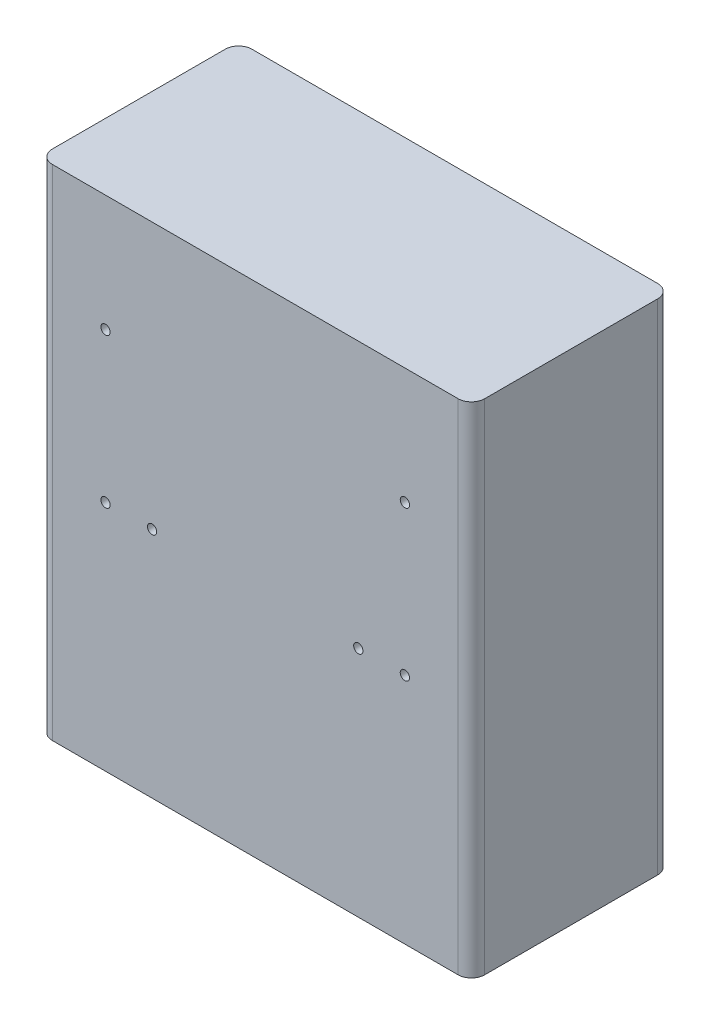
ISO-10303-21;
HEADER;
FILE_DESCRIPTION(('STEP AP214'),'2;1');
FILE_NAME('part.step','',(''),(''),'','','');
FILE_SCHEMA(('AUTOMOTIVE_DESIGN { 1 0 10303 214 1 1 1 1 }'));
ENDSEC;
DATA;
#1=APPLICATION_CONTEXT('core data for automotive mechanical design processes');
#2=APPLICATION_PROTOCOL_DEFINITION('international standard','automotive_design',2000,#1);
#3=PRODUCT_CONTEXT('',#1,'mechanical');
#4=PRODUCT('Part','Part','',(#3));
#5=PRODUCT_RELATED_PRODUCT_CATEGORY('part','',(#4));
#6=PRODUCT_DEFINITION_FORMATION('','',#4);
#7=PRODUCT_DEFINITION_CONTEXT('part definition',#1,'design');
#8=PRODUCT_DEFINITION('design','',#6,#7);
#9=PRODUCT_DEFINITION_SHAPE('','',#8);
#10=(LENGTH_UNIT() NAMED_UNIT(*) SI_UNIT(.MILLI.,.METRE.));
#11=(NAMED_UNIT(*) PLANE_ANGLE_UNIT() SI_UNIT($,.RADIAN.));
#12=(NAMED_UNIT(*) SI_UNIT($,.STERADIAN.) SOLID_ANGLE_UNIT());
#13=UNCERTAINTY_MEASURE_WITH_UNIT(LENGTH_MEASURE(1.E-05),#10,'distance_accuracy_value','');
#14=(GEOMETRIC_REPRESENTATION_CONTEXT(3) GLOBAL_UNCERTAINTY_ASSIGNED_CONTEXT((#13)) GLOBAL_UNIT_ASSIGNED_CONTEXT((#10,
#11,#12)) REPRESENTATION_CONTEXT('',''));
#15=CARTESIAN_POINT('',(0.,0.,0.));
#16=DIRECTION('',(0.,0.,1.));
#17=DIRECTION('',(1.,0.,0.));
#18=AXIS2_PLACEMENT_3D('',#15,#16,#17);
#19=CARTESIAN_POINT('',(41.275,-47.625,19.05));
#20=DIRECTION('',(-1.,0.,0.));
#21=DIRECTION('',(0.,0.,1.));
#22=AXIS2_PLACEMENT_3D('',#19,#20,#21);
#23=PLANE('',#22);
#24=DIRECTION('',(0.,0.,-1.));
#25=VECTOR('',#24,1.);
#26=CARTESIAN_POINT('',(41.275,-47.625,19.05));
#27=LINE('',#26,#25);
#28=CARTESIAN_POINT('',(41.275,-47.625,16.51));
#29=VERTEX_POINT('',#28);
#30=CARTESIAN_POINT('',(41.275,-47.625,-16.51));
#31=VERTEX_POINT('',#30);
#32=EDGE_CURVE('E121',#29,#31,#27,.T.);
#33=ORIENTED_EDGE('',*,*,#32,.T.);
#34=DIRECTION('',(0.,1.,0.));
#35=VECTOR('',#34,1.);
#36=CARTESIAN_POINT('',(41.275,47.625,-16.51));
#37=LINE('',#36,#35);
#38=CARTESIAN_POINT('',(41.275,47.625,-16.51));
#39=VERTEX_POINT('',#38);
#40=EDGE_CURVE('E147',#31,#39,#37,.T.);
#41=ORIENTED_EDGE('',*,*,#40,.T.);
#42=DIRECTION('',(0.,0.,-1.));
#43=VECTOR('',#42,1.);
#44=CARTESIAN_POINT('',(41.275,47.625,19.05));
#45=LINE('',#44,#43);
#46=CARTESIAN_POINT('',(41.275,47.625,16.51));
#47=VERTEX_POINT('',#46);
#48=EDGE_CURVE('E125',#47,#39,#45,.T.);
#49=ORIENTED_EDGE('',*,*,#48,.F.);
#50=DIRECTION('',(0.,1.,0.));
#51=VECTOR('',#50,1.);
#52=CARTESIAN_POINT('',(41.275,-47.625,16.51));
#53=LINE('',#52,#51);
#54=EDGE_CURVE('E145',#47,#29,#53,.F.);
#55=ORIENTED_EDGE('',*,*,#54,.T.);
#56=EDGE_LOOP('',(#33,#41,#49,#55));
#57=FACE_BOUND('',#56,.T.);
#58=ADVANCED_FACE('F33',(#57),#23,.F.);
#59=CARTESIAN_POINT('',(-41.275,47.625,19.05));
#60=DIRECTION('',(0.,-1.,0.));
#61=DIRECTION('',(0.,0.,-1.));
#62=AXIS2_PLACEMENT_3D('',#59,#60,#61);
#63=PLANE('',#62);
#64=DIRECTION('',(-1.,0.,0.));
#65=VECTOR('',#64,1.);
#66=CARTESIAN_POINT('',(-41.275,47.625,-19.05));
#67=LINE('',#66,#65);
#68=CARTESIAN_POINT('',(38.735,47.625,-19.05));
#69=VERTEX_POINT('',#68);
#70=CARTESIAN_POINT('',(-38.735,47.625,-19.05));
#71=VERTEX_POINT('',#70);
#72=EDGE_CURVE('E157',#69,#71,#67,.T.);
#73=ORIENTED_EDGE('',*,*,#72,.T.);
#74=CARTESIAN_POINT('',(-38.735,47.625,-16.51));
#75=DIRECTION('',(0.,-1.,0.));
#76=DIRECTION('',(0.,0.,-1.));
#77=AXIS2_PLACEMENT_3D('',#74,#75,#76);
#78=CIRCLE('',#77,2.54);
#79=CARTESIAN_POINT('',(-41.275,47.625,-16.51));
#80=VERTEX_POINT('',#79);
#81=EDGE_CURVE('E143',#71,#80,#78,.F.);
#82=ORIENTED_EDGE('',*,*,#81,.T.);
#83=DIRECTION('',(0.,0.,-1.));
#84=VECTOR('',#83,1.);
#85=CARTESIAN_POINT('',(-41.275,47.625,19.05));
#86=LINE('',#85,#84);
#87=CARTESIAN_POINT('',(-41.275,47.625,16.51));
#88=VERTEX_POINT('',#87);
#89=EDGE_CURVE('E120',#88,#80,#86,.T.);
#90=ORIENTED_EDGE('',*,*,#89,.F.);
#91=CARTESIAN_POINT('',(-38.735,47.625,16.51));
#92=DIRECTION('',(0.,-1.,0.));
#93=DIRECTION('',(0.,0.,-1.));
#94=AXIS2_PLACEMENT_3D('',#91,#92,#93);
#95=CIRCLE('',#94,2.54);
#96=CARTESIAN_POINT('',(-38.735,47.625,19.05));
#97=VERTEX_POINT('',#96);
#98=EDGE_CURVE('E124',#88,#97,#95,.F.);
#99=ORIENTED_EDGE('',*,*,#98,.T.);
#100=DIRECTION('',(-1.,0.,0.));
#101=VECTOR('',#100,1.);
#102=CARTESIAN_POINT('',(-41.275,47.625,19.05));
#103=LINE('',#102,#101);
#104=CARTESIAN_POINT('',(38.735,47.625,19.05));
#105=VERTEX_POINT('',#104);
#106=EDGE_CURVE('E152',#105,#97,#103,.T.);
#107=ORIENTED_EDGE('',*,*,#106,.F.);
#108=CARTESIAN_POINT('',(38.735,47.625,16.51));
#109=DIRECTION('',(0.,-1.,0.));
#110=DIRECTION('',(0.,0.,-1.));
#111=AXIS2_PLACEMENT_3D('',#108,#109,#110);
#112=CIRCLE('',#111,2.54);
#113=EDGE_CURVE('E56',#105,#47,#112,.F.);
#114=ORIENTED_EDGE('',*,*,#113,.T.);
#115=ORIENTED_EDGE('',*,*,#48,.T.);
#116=CARTESIAN_POINT('',(38.735,47.625,-16.51));
#117=DIRECTION('',(0.,-1.,0.));
#118=DIRECTION('',(0.,0.,-1.));
#119=AXIS2_PLACEMENT_3D('',#116,#117,#118);
#120=CIRCLE('',#119,2.54);
#121=EDGE_CURVE('E48',#39,#69,#120,.F.);
#122=ORIENTED_EDGE('',*,*,#121,.T.);
#123=EDGE_LOOP('',(#73,#82,#90,#99,#107,#114,#115,#122));
#124=FACE_BOUND('',#123,.T.);
#125=ADVANCED_FACE('F190',(#124),#63,.F.);
#126=CARTESIAN_POINT('',(-41.275,-47.625,19.05));
#127=DIRECTION('',(1.,0.,0.));
#128=DIRECTION('',(0.,0.,-1.));
#129=AXIS2_PLACEMENT_3D('',#126,#127,#128);
#130=PLANE('',#129);
#131=ORIENTED_EDGE('',*,*,#89,.T.);
#132=DIRECTION('',(0.,-1.,0.));
#133=VECTOR('',#132,1.);
#134=CARTESIAN_POINT('',(-41.275,-47.625,-16.51));
#135=LINE('',#134,#133);
#136=CARTESIAN_POINT('',(-41.275,-47.625,-16.51));
#137=VERTEX_POINT('',#136);
#138=EDGE_CURVE('E111',#80,#137,#135,.T.);
#139=ORIENTED_EDGE('',*,*,#138,.T.);
#140=DIRECTION('',(0.,0.,-1.));
#141=VECTOR('',#140,1.);
#142=CARTESIAN_POINT('',(-41.275,-47.625,19.05));
#143=LINE('',#142,#141);
#144=CARTESIAN_POINT('',(-41.275,-47.625,16.51));
#145=VERTEX_POINT('',#144);
#146=EDGE_CURVE('E103',#145,#137,#143,.T.);
#147=ORIENTED_EDGE('',*,*,#146,.F.);
#148=DIRECTION('',(0.,-1.,0.));
#149=VECTOR('',#148,1.);
#150=CARTESIAN_POINT('',(-41.275,-47.625,16.51));
#151=LINE('',#150,#149);
#152=EDGE_CURVE('E117',#145,#88,#151,.F.);
#153=ORIENTED_EDGE('',*,*,#152,.T.);
#154=EDGE_LOOP('',(#131,#139,#147,#153));
#155=FACE_BOUND('',#154,.T.);
#156=ADVANCED_FACE('F116',(#155),#130,.F.);
#157=CARTESIAN_POINT('',(-41.275,-47.625,19.05));
#158=DIRECTION('',(0.,1.,0.));
#159=DIRECTION('',(0.,0.,1.));
#160=AXIS2_PLACEMENT_3D('',#157,#158,#159);
#161=PLANE('',#160);
#162=ORIENTED_EDGE('',*,*,#146,.T.);
#163=CARTESIAN_POINT('',(-38.735,-47.625,-16.51));
#164=DIRECTION('',(0.,1.,0.));
#165=DIRECTION('',(0.,0.,1.));
#166=AXIS2_PLACEMENT_3D('',#163,#164,#165);
#167=CIRCLE('',#166,2.54);
#168=CARTESIAN_POINT('',(-38.735,-47.625,-19.05));
#169=VERTEX_POINT('',#168);
#170=EDGE_CURVE('E134',#137,#169,#167,.F.);
#171=ORIENTED_EDGE('',*,*,#170,.T.);
#172=DIRECTION('',(1.,0.,0.));
#173=VECTOR('',#172,1.);
#174=CARTESIAN_POINT('',(-41.275,-47.625,-19.05));
#175=LINE('',#174,#173);
#176=CARTESIAN_POINT('',(38.735,-47.625,-19.05));
#177=VERTEX_POINT('',#176);
#178=EDGE_CURVE('E153',#169,#177,#175,.T.);
#179=ORIENTED_EDGE('',*,*,#178,.T.);
#180=CARTESIAN_POINT('',(38.735,-47.625,-16.51));
#181=DIRECTION('',(0.,1.,0.));
#182=DIRECTION('',(0.,0.,1.));
#183=AXIS2_PLACEMENT_3D('',#180,#181,#182);
#184=CIRCLE('',#183,2.54);
#185=EDGE_CURVE('E132',#177,#31,#184,.F.);
#186=ORIENTED_EDGE('',*,*,#185,.T.);
#187=ORIENTED_EDGE('',*,*,#32,.F.);
#188=CARTESIAN_POINT('',(38.735,-47.625,16.51));
#189=DIRECTION('',(0.,1.,0.));
#190=DIRECTION('',(0.,0.,1.));
#191=AXIS2_PLACEMENT_3D('',#188,#189,#190);
#192=CIRCLE('',#191,2.54);
#193=CARTESIAN_POINT('',(38.735,-47.625,19.05));
#194=VERTEX_POINT('',#193);
#195=EDGE_CURVE('E110',#29,#194,#192,.F.);
#196=ORIENTED_EDGE('',*,*,#195,.T.);
#197=DIRECTION('',(1.,0.,0.));
#198=VECTOR('',#197,1.);
#199=CARTESIAN_POINT('',(-41.275,-47.625,19.05));
#200=LINE('',#199,#198);
#201=CARTESIAN_POINT('',(-38.735,-47.625,19.05));
#202=VERTEX_POINT('',#201);
#203=EDGE_CURVE('E105',#202,#194,#200,.T.);
#204=ORIENTED_EDGE('',*,*,#203,.F.);
#205=CARTESIAN_POINT('',(-38.735,-47.625,16.51));
#206=DIRECTION('',(0.,1.,0.));
#207=DIRECTION('',(0.,0.,1.));
#208=AXIS2_PLACEMENT_3D('',#205,#206,#207);
#209=CIRCLE('',#208,2.54);
#210=EDGE_CURVE('E100',#202,#145,#209,.F.);
#211=ORIENTED_EDGE('',*,*,#210,.T.);
#212=EDGE_LOOP('',(#162,#171,#179,#186,#187,#196,#204,#211));
#213=FACE_BOUND('',#212,.T.);
#214=ADVANCED_FACE('F102',(#213),#161,.F.);
#215=CARTESIAN_POINT('',(0.,0.,19.05));
#216=DIRECTION('',(0.,0.,-1.));
#217=DIRECTION('',(-1.,0.,0.));
#218=AXIS2_PLACEMENT_3D('',#215,#216,#217);
#219=PLANE('',#218);
#220=CARTESIAN_POINT('',(28.575,25.4,19.05));
#221=DIRECTION('',(0.,0.,1.));
#222=DIRECTION('',(1.,0.,0.));
#223=AXIS2_PLACEMENT_3D('',#220,#221,#222);
#224=CIRCLE('',#223,0.888999999999997);
#225=CARTESIAN_POINT('',(29.464,25.4,19.05));
#226=VERTEX_POINT('',#225);
#227=EDGE_CURVE('E365',#226,#226,#224,.T.);
#228=ORIENTED_EDGE('',*,*,#227,.F.);
#229=EDGE_LOOP('',(#228));
#230=FACE_BOUND('',#229,.T.);
#231=CARTESIAN_POINT('',(28.575,-3.17499999999999,19.05));
#232=DIRECTION('',(0.,0.,1.));
#233=DIRECTION('',(1.,0.,0.));
#234=AXIS2_PLACEMENT_3D('',#231,#232,#233);
#235=CIRCLE('',#234,0.889);
#236=CARTESIAN_POINT('',(29.464,-3.17499999999999,19.05));
#237=VERTEX_POINT('',#236);
#238=EDGE_CURVE('E361',#237,#237,#235,.T.);
#239=ORIENTED_EDGE('',*,*,#238,.F.);
#240=EDGE_LOOP('',(#239));
#241=FACE_BOUND('',#240,.T.);
#242=CARTESIAN_POINT('',(-28.575,-3.17499999999999,19.05));
#243=DIRECTION('',(0.,0.,1.));
#244=DIRECTION('',(1.,0.,0.));
#245=AXIS2_PLACEMENT_3D('',#242,#243,#244);
#246=CIRCLE('',#245,0.889);
#247=CARTESIAN_POINT('',(-27.686,-3.17499999999999,19.05));
#248=VERTEX_POINT('',#247);
#249=EDGE_CURVE('E357',#248,#248,#246,.T.);
#250=ORIENTED_EDGE('',*,*,#249,.F.);
#251=EDGE_LOOP('',(#250));
#252=FACE_BOUND('',#251,.T.);
#253=CARTESIAN_POINT('',(-19.685,-3.17499999999999,19.05));
#254=DIRECTION('',(0.,0.,1.));
#255=DIRECTION('',(1.,0.,0.));
#256=AXIS2_PLACEMENT_3D('',#253,#254,#255);
#257=CIRCLE('',#256,0.889);
#258=CARTESIAN_POINT('',(-18.796,-3.17499999999999,19.05));
#259=VERTEX_POINT('',#258);
#260=EDGE_CURVE('E353',#259,#259,#257,.T.);
#261=ORIENTED_EDGE('',*,*,#260,.F.);
#262=EDGE_LOOP('',(#261));
#263=FACE_BOUND('',#262,.T.);
#264=CARTESIAN_POINT('',(19.685,-3.17499999999999,19.05));
#265=DIRECTION('',(0.,0.,1.));
#266=DIRECTION('',(1.,0.,0.));
#267=AXIS2_PLACEMENT_3D('',#264,#265,#266);
#268=CIRCLE('',#267,0.889);
#269=CARTESIAN_POINT('',(20.574,-3.17499999999999,19.05));
#270=VERTEX_POINT('',#269);
#271=EDGE_CURVE('E349',#270,#270,#268,.T.);
#272=ORIENTED_EDGE('',*,*,#271,.F.);
#273=EDGE_LOOP('',(#272));
#274=FACE_BOUND('',#273,.T.);
#275=CARTESIAN_POINT('',(-28.575,25.4,19.05));
#276=DIRECTION('',(0.,0.,1.));
#277=DIRECTION('',(1.,0.,0.));
#278=AXIS2_PLACEMENT_3D('',#275,#276,#277);
#279=CIRCLE('',#278,0.888999999999997);
#280=CARTESIAN_POINT('',(-27.686,25.4,19.05));
#281=VERTEX_POINT('',#280);
#282=EDGE_CURVE('E160',#281,#281,#279,.T.);
#283=ORIENTED_EDGE('',*,*,#282,.F.);
#284=EDGE_LOOP('',(#283));
#285=FACE_BOUND('',#284,.T.);
#286=ORIENTED_EDGE('',*,*,#203,.T.);
#287=DIRECTION('',(0.,1.,0.));
#288=VECTOR('',#287,1.);
#289=CARTESIAN_POINT('',(38.735,0.,19.05));
#290=LINE('',#289,#288);
#291=EDGE_CURVE('E11',#194,#105,#290,.T.);
#292=ORIENTED_EDGE('',*,*,#291,.T.);
#293=ORIENTED_EDGE('',*,*,#106,.T.);
#294=DIRECTION('',(0.,-1.,0.));
#295=VECTOR('',#294,1.);
#296=CARTESIAN_POINT('',(-38.735,0.,19.05));
#297=LINE('',#296,#295);
#298=EDGE_CURVE('E41',#97,#202,#297,.T.);
#299=ORIENTED_EDGE('',*,*,#298,.T.);
#300=EDGE_LOOP('',(#286,#292,#293,#299));
#301=FACE_BOUND('',#300,.T.);
#302=ADVANCED_FACE('F150',(#230,#241,#252,#263,#274,#285,#301),#219,.F.);
#303=CARTESIAN_POINT('',(0.,0.,-19.05));
#304=DIRECTION('',(0.,0.,-1.));
#305=DIRECTION('',(-1.,0.,0.));
#306=AXIS2_PLACEMENT_3D('',#303,#304,#305);
#307=PLANE('',#306);
#308=CARTESIAN_POINT('',(28.575,25.4,-19.05));
#309=DIRECTION('',(0.,0.,1.));
#310=DIRECTION('',(1.,0.,0.));
#311=AXIS2_PLACEMENT_3D('',#308,#309,#310);
#312=CIRCLE('',#311,0.888999999999997);
#313=CARTESIAN_POINT('',(29.464,25.4,-19.05));
#314=VERTEX_POINT('',#313);
#315=EDGE_CURVE('E328',#314,#314,#312,.T.);
#316=ORIENTED_EDGE('',*,*,#315,.T.);
#317=EDGE_LOOP('',(#316));
#318=FACE_BOUND('',#317,.T.);
#319=CARTESIAN_POINT('',(28.575,-3.17499999999999,-19.05));
#320=DIRECTION('',(0.,0.,1.));
#321=DIRECTION('',(1.,0.,0.));
#322=AXIS2_PLACEMENT_3D('',#319,#320,#321);
#323=CIRCLE('',#322,0.889);
#324=CARTESIAN_POINT('',(29.464,-3.17499999999999,-19.05));
#325=VERTEX_POINT('',#324);
#326=EDGE_CURVE('E332',#325,#325,#323,.T.);
#327=ORIENTED_EDGE('',*,*,#326,.T.);
#328=EDGE_LOOP('',(#327));
#329=FACE_BOUND('',#328,.T.);
#330=CARTESIAN_POINT('',(-28.575,-3.17499999999999,-19.05));
#331=DIRECTION('',(0.,0.,1.));
#332=DIRECTION('',(1.,0.,0.));
#333=AXIS2_PLACEMENT_3D('',#330,#331,#332);
#334=CIRCLE('',#333,0.889);
#335=CARTESIAN_POINT('',(-27.686,-3.17499999999999,-19.05));
#336=VERTEX_POINT('',#335);
#337=EDGE_CURVE('E336',#336,#336,#334,.T.);
#338=ORIENTED_EDGE('',*,*,#337,.T.);
#339=EDGE_LOOP('',(#338));
#340=FACE_BOUND('',#339,.T.);
#341=CARTESIAN_POINT('',(-19.685,-3.17499999999999,-19.05));
#342=DIRECTION('',(0.,0.,1.));
#343=DIRECTION('',(1.,0.,0.));
#344=AXIS2_PLACEMENT_3D('',#341,#342,#343);
#345=CIRCLE('',#344,0.889);
#346=CARTESIAN_POINT('',(-18.796,-3.17499999999999,-19.05));
#347=VERTEX_POINT('',#346);
#348=EDGE_CURVE('E340',#347,#347,#345,.T.);
#349=ORIENTED_EDGE('',*,*,#348,.T.);
#350=EDGE_LOOP('',(#349));
#351=FACE_BOUND('',#350,.T.);
#352=CARTESIAN_POINT('',(19.685,-3.17499999999999,-19.05));
#353=DIRECTION('',(0.,0.,1.));
#354=DIRECTION('',(1.,0.,0.));
#355=AXIS2_PLACEMENT_3D('',#352,#353,#354);
#356=CIRCLE('',#355,0.889);
#357=CARTESIAN_POINT('',(20.574,-3.17499999999999,-19.05));
#358=VERTEX_POINT('',#357);
#359=EDGE_CURVE('E344',#358,#358,#356,.T.);
#360=ORIENTED_EDGE('',*,*,#359,.T.);
#361=EDGE_LOOP('',(#360));
#362=FACE_BOUND('',#361,.T.);
#363=CARTESIAN_POINT('',(-28.575,25.4,-19.05));
#364=DIRECTION('',(0.,0.,1.));
#365=DIRECTION('',(1.,0.,0.));
#366=AXIS2_PLACEMENT_3D('',#363,#364,#365);
#367=CIRCLE('',#366,0.888999999999997);
#368=CARTESIAN_POINT('',(-27.686,25.4,-19.05));
#369=VERTEX_POINT('',#368);
#370=EDGE_CURVE('E164',#369,#369,#367,.T.);
#371=ORIENTED_EDGE('',*,*,#370,.T.);
#372=EDGE_LOOP('',(#371));
#373=FACE_BOUND('',#372,.T.);
#374=ORIENTED_EDGE('',*,*,#178,.F.);
#375=DIRECTION('',(0.,-1.,0.));
#376=VECTOR('',#375,1.);
#377=CARTESIAN_POINT('',(-38.735,47.625,-19.05));
#378=LINE('',#377,#376);
#379=EDGE_CURVE('E138',#169,#71,#378,.F.);
#380=ORIENTED_EDGE('',*,*,#379,.T.);
#381=ORIENTED_EDGE('',*,*,#72,.F.);
#382=DIRECTION('',(0.,1.,0.));
#383=VECTOR('',#382,1.);
#384=CARTESIAN_POINT('',(38.735,-47.625,-19.05));
#385=LINE('',#384,#383);
#386=EDGE_CURVE('E136',#69,#177,#385,.F.);
#387=ORIENTED_EDGE('',*,*,#386,.T.);
#388=EDGE_LOOP('',(#374,#380,#381,#387));
#389=FACE_BOUND('',#388,.T.);
#390=ADVANCED_FACE('F174',(#318,#329,#340,#351,#362,#373,#389),#307,.T.);
#391=CARTESIAN_POINT('',(-28.575,25.4,-19.05));
#392=DIRECTION('',(0.,0.,1.));
#393=DIRECTION('',(1.,0.,0.));
#394=AXIS2_PLACEMENT_3D('',#391,#392,#393);
#395=CYLINDRICAL_SURFACE('',#394,0.888999999999997);
#396=CARTESIAN_POINT('',(-27.686,25.4,-19.05));
#397=CARTESIAN_POINT('',(-27.686,25.4,-18.653125));
#398=CARTESIAN_POINT('',(-27.686,25.4,-18.25625));
#399=CARTESIAN_POINT('',(-27.686,25.4,-17.4625));
#400=CARTESIAN_POINT('',(-27.686,25.4,-17.065625));
#401=CARTESIAN_POINT('',(-27.686,25.4,-16.271875));
#402=CARTESIAN_POINT('',(-27.686,25.4,-15.875));
#403=CARTESIAN_POINT('',(-27.686,25.4,-15.08125));
#404=CARTESIAN_POINT('',(-27.686,25.4,-14.684375));
#405=CARTESIAN_POINT('',(-27.686,25.4,-13.890625));
#406=CARTESIAN_POINT('',(-27.686,25.4,-13.49375));
#407=CARTESIAN_POINT('',(-27.686,25.4,-12.7));
#408=CARTESIAN_POINT('',(-27.686,25.4,-12.303125));
#409=CARTESIAN_POINT('',(-27.686,25.4,-11.509375));
#410=CARTESIAN_POINT('',(-27.686,25.4,-11.1125));
#411=CARTESIAN_POINT('',(-27.686,25.4,-10.31875));
#412=CARTESIAN_POINT('',(-27.686,25.4,-9.921875));
#413=CARTESIAN_POINT('',(-27.686,25.4,-9.128125));
#414=CARTESIAN_POINT('',(-27.686,25.4,-8.73125));
#415=CARTESIAN_POINT('',(-27.686,25.4,-7.9375));
#416=CARTESIAN_POINT('',(-27.686,25.4,-7.540625));
#417=CARTESIAN_POINT('',(-27.686,25.4,-6.746875));
#418=CARTESIAN_POINT('',(-27.686,25.4,-6.35));
#419=CARTESIAN_POINT('',(-27.686,25.4,-5.55625));
#420=CARTESIAN_POINT('',(-27.686,25.4,-5.159375));
#421=CARTESIAN_POINT('',(-27.686,25.4,-4.365625));
#422=CARTESIAN_POINT('',(-27.686,25.4,-3.96875));
#423=CARTESIAN_POINT('',(-27.686,25.4,-3.175));
#424=CARTESIAN_POINT('',(-27.686,25.4,-2.778125));
#425=CARTESIAN_POINT('',(-27.686,25.4,-1.984375));
#426=CARTESIAN_POINT('',(-27.686,25.4,-1.5875));
#427=CARTESIAN_POINT('',(-27.686,25.4,-0.79375));
#428=CARTESIAN_POINT('',(-27.686,25.4,-0.396875));
#429=CARTESIAN_POINT('',(-27.686,25.4,0.396875));
#430=CARTESIAN_POINT('',(-27.686,25.4,0.79375));
#431=CARTESIAN_POINT('',(-27.686,25.4,1.5875));
#432=CARTESIAN_POINT('',(-27.686,25.4,1.984375));
#433=CARTESIAN_POINT('',(-27.686,25.4,2.778125));
#434=CARTESIAN_POINT('',(-27.686,25.4,3.175));
#435=CARTESIAN_POINT('',(-27.686,25.4,3.96875));
#436=CARTESIAN_POINT('',(-27.686,25.4,4.365625));
#437=CARTESIAN_POINT('',(-27.686,25.4,5.159375));
#438=CARTESIAN_POINT('',(-27.686,25.4,5.55625));
#439=CARTESIAN_POINT('',(-27.686,25.4,6.35));
#440=CARTESIAN_POINT('',(-27.686,25.4,6.746875));
#441=CARTESIAN_POINT('',(-27.686,25.4,7.540625));
#442=CARTESIAN_POINT('',(-27.686,25.4,7.9375));
#443=CARTESIAN_POINT('',(-27.686,25.4,8.73125));
#444=CARTESIAN_POINT('',(-27.686,25.4,9.128125));
#445=CARTESIAN_POINT('',(-27.686,25.4,9.921875));
#446=CARTESIAN_POINT('',(-27.686,25.4,10.31875));
#447=CARTESIAN_POINT('',(-27.686,25.4,11.1125));
#448=CARTESIAN_POINT('',(-27.686,25.4,11.509375));
#449=CARTESIAN_POINT('',(-27.686,25.4,12.303125));
#450=CARTESIAN_POINT('',(-27.686,25.4,12.7));
#451=CARTESIAN_POINT('',(-27.686,25.4,13.49375));
#452=CARTESIAN_POINT('',(-27.686,25.4,13.890625));
#453=CARTESIAN_POINT('',(-27.686,25.4,14.684375));
#454=CARTESIAN_POINT('',(-27.686,25.4,15.08125));
#455=CARTESIAN_POINT('',(-27.686,25.4,15.875));
#456=CARTESIAN_POINT('',(-27.686,25.4,16.271875));
#457=CARTESIAN_POINT('',(-27.686,25.4,17.065625));
#458=CARTESIAN_POINT('',(-27.686,25.4,17.4625));
#459=CARTESIAN_POINT('',(-27.686,25.4,18.25625));
#460=CARTESIAN_POINT('',(-27.686,25.4,18.653125));
#461=CARTESIAN_POINT('',(-27.686,25.4,19.05));
#462=B_SPLINE_CURVE_WITH_KNOTS('',3,(#396,#397,#398,#399,#400,#401,#402,#403,#404,#405,#406,
#407,#408,#409,#410,#411,#412,#413,#414,#415,#416,#417,#418,#419,#420,#421,#422,#423,#424,#425,
#426,#427,#428,#429,#430,#431,#432,#433,#434,#435,#436,#437,#438,#439,#440,#441,#442,#443,#444,
#445,#446,#447,#448,#449,#450,#451,#452,#453,#454,#455,#456,#457,#458,#459,#460,#461),
.UNSPECIFIED.,.F.,.F.,(4,2,2,2,2,2,2,2,2,2,2,2,2,2,2,2,2,2,2,2,2,2,2,2,2,2,2,2,2,2,2,2,4),(0.,
1.190625,2.38125,3.571875,4.7625,5.953125,7.14375,8.334375,9.525,10.715625,11.90625,13.096875,
14.2875,15.478125,16.66875,17.859375,19.05,20.240625,21.43125,22.621875,23.8125,25.003125,
26.19375,27.384375,28.575,29.765625,30.95625,32.146875,33.3375,34.528125,35.71875,36.909375,
38.1),.UNSPECIFIED.);
#463=EDGE_CURVE('BSEAM225',#369,#281,#462,.T.);
#464=ORIENTED_EDGE('',*,*,#370,.F.);
#465=ORIENTED_EDGE('',*,*,#282,.T.);
#466=ORIENTED_EDGE('',*,*,#463,.T.);
#467=ORIENTED_EDGE('',*,*,#463,.F.);
#468=EDGE_LOOP('',(#464,#466,#465,#467));
#469=FACE_BOUND('',#468,.T.);
#470=ADVANCED_FACE('F225',(#469),#395,.F.);
#471=CARTESIAN_POINT('',(19.685,-3.17499999999999,-19.05));
#472=DIRECTION('',(0.,0.,1.));
#473=DIRECTION('',(1.,0.,0.));
#474=AXIS2_PLACEMENT_3D('',#471,#472,#473);
#475=CYLINDRICAL_SURFACE('',#474,0.889);
#476=CARTESIAN_POINT('',(20.574,-3.17499999999999,-19.05));
#477=CARTESIAN_POINT('',(20.574,-3.17499999999999,-18.653125));
#478=CARTESIAN_POINT('',(20.574,-3.17499999999999,-18.25625));
#479=CARTESIAN_POINT('',(20.574,-3.17499999999999,-17.4625));
#480=CARTESIAN_POINT('',(20.574,-3.17499999999999,-17.065625));
#481=CARTESIAN_POINT('',(20.574,-3.17499999999999,-16.271875));
#482=CARTESIAN_POINT('',(20.574,-3.17499999999999,-15.875));
#483=CARTESIAN_POINT('',(20.574,-3.17499999999999,-15.08125));
#484=CARTESIAN_POINT('',(20.574,-3.17499999999999,-14.684375));
#485=CARTESIAN_POINT('',(20.574,-3.17499999999999,-13.890625));
#486=CARTESIAN_POINT('',(20.574,-3.17499999999999,-13.49375));
#487=CARTESIAN_POINT('',(20.574,-3.17499999999999,-12.7));
#488=CARTESIAN_POINT('',(20.574,-3.17499999999999,-12.303125));
#489=CARTESIAN_POINT('',(20.574,-3.17499999999999,-11.509375));
#490=CARTESIAN_POINT('',(20.574,-3.17499999999999,-11.1125));
#491=CARTESIAN_POINT('',(20.574,-3.17499999999999,-10.31875));
#492=CARTESIAN_POINT('',(20.574,-3.17499999999999,-9.921875));
#493=CARTESIAN_POINT('',(20.574,-3.17499999999999,-9.128125));
#494=CARTESIAN_POINT('',(20.574,-3.17499999999999,-8.73125));
#495=CARTESIAN_POINT('',(20.574,-3.17499999999999,-7.9375));
#496=CARTESIAN_POINT('',(20.574,-3.17499999999999,-7.540625));
#497=CARTESIAN_POINT('',(20.574,-3.17499999999999,-6.746875));
#498=CARTESIAN_POINT('',(20.574,-3.17499999999999,-6.35));
#499=CARTESIAN_POINT('',(20.574,-3.17499999999999,-5.55625));
#500=CARTESIAN_POINT('',(20.574,-3.17499999999999,-5.159375));
#501=CARTESIAN_POINT('',(20.574,-3.17499999999999,-4.365625));
#502=CARTESIAN_POINT('',(20.574,-3.17499999999999,-3.96875));
#503=CARTESIAN_POINT('',(20.574,-3.17499999999999,-3.175));
#504=CARTESIAN_POINT('',(20.574,-3.17499999999999,-2.778125));
#505=CARTESIAN_POINT('',(20.574,-3.17499999999999,-1.984375));
#506=CARTESIAN_POINT('',(20.574,-3.17499999999999,-1.5875));
#507=CARTESIAN_POINT('',(20.574,-3.17499999999999,-0.79375));
#508=CARTESIAN_POINT('',(20.574,-3.17499999999999,-0.396875));
#509=CARTESIAN_POINT('',(20.574,-3.17499999999999,0.396875));
#510=CARTESIAN_POINT('',(20.574,-3.17499999999999,0.79375));
#511=CARTESIAN_POINT('',(20.574,-3.17499999999999,1.5875));
#512=CARTESIAN_POINT('',(20.574,-3.17499999999999,1.984375));
#513=CARTESIAN_POINT('',(20.574,-3.17499999999999,2.778125));
#514=CARTESIAN_POINT('',(20.574,-3.17499999999999,3.175));
#515=CARTESIAN_POINT('',(20.574,-3.17499999999999,3.96875));
#516=CARTESIAN_POINT('',(20.574,-3.17499999999999,4.365625));
#517=CARTESIAN_POINT('',(20.574,-3.17499999999999,5.159375));
#518=CARTESIAN_POINT('',(20.574,-3.17499999999999,5.55625));
#519=CARTESIAN_POINT('',(20.574,-3.17499999999999,6.35));
#520=CARTESIAN_POINT('',(20.574,-3.17499999999999,6.746875));
#521=CARTESIAN_POINT('',(20.574,-3.17499999999999,7.540625));
#522=CARTESIAN_POINT('',(20.574,-3.17499999999999,7.9375));
#523=CARTESIAN_POINT('',(20.574,-3.17499999999999,8.73125));
#524=CARTESIAN_POINT('',(20.574,-3.17499999999999,9.128125));
#525=CARTESIAN_POINT('',(20.574,-3.17499999999999,9.921875));
#526=CARTESIAN_POINT('',(20.574,-3.17499999999999,10.31875));
#527=CARTESIAN_POINT('',(20.574,-3.17499999999999,11.1125));
#528=CARTESIAN_POINT('',(20.574,-3.17499999999999,11.509375));
#529=CARTESIAN_POINT('',(20.574,-3.17499999999999,12.303125));
#530=CARTESIAN_POINT('',(20.574,-3.17499999999999,12.7));
#531=CARTESIAN_POINT('',(20.574,-3.17499999999999,13.49375));
#532=CARTESIAN_POINT('',(20.574,-3.17499999999999,13.890625));
#533=CARTESIAN_POINT('',(20.574,-3.17499999999999,14.684375));
#534=CARTESIAN_POINT('',(20.574,-3.17499999999999,15.08125));
#535=CARTESIAN_POINT('',(20.574,-3.17499999999999,15.875));
#536=CARTESIAN_POINT('',(20.574,-3.17499999999999,16.271875));
#537=CARTESIAN_POINT('',(20.574,-3.17499999999999,17.065625));
#538=CARTESIAN_POINT('',(20.574,-3.17499999999999,17.4625));
#539=CARTESIAN_POINT('',(20.574,-3.17499999999999,18.25625));
#540=CARTESIAN_POINT('',(20.574,-3.17499999999999,18.653125));
#541=CARTESIAN_POINT('',(20.574,-3.17499999999999,19.05));
#542=B_SPLINE_CURVE_WITH_KNOTS('',3,(#476,#477,#478,#479,#480,#481,#482,#483,#484,#485,#486,
#487,#488,#489,#490,#491,#492,#493,#494,#495,#496,#497,#498,#499,#500,#501,#502,#503,#504,#505,
#506,#507,#508,#509,#510,#511,#512,#513,#514,#515,#516,#517,#518,#519,#520,#521,#522,#523,#524,
#525,#526,#527,#528,#529,#530,#531,#532,#533,#534,#535,#536,#537,#538,#539,#540,#541),
.UNSPECIFIED.,.F.,.F.,(4,2,2,2,2,2,2,2,2,2,2,2,2,2,2,2,2,2,2,2,2,2,2,2,2,2,2,2,2,2,2,2,4),(0.,
1.190625,2.38125,3.571875,4.7625,5.953125,7.14375,8.334375,9.525,10.715625,11.90625,13.096875,
14.2875,15.478125,16.66875,17.859375,19.05,20.240625,21.43125,22.621875,23.8125,25.003125,
26.19375,27.384375,28.575,29.765625,30.95625,32.146875,33.3375,34.528125,35.71875,36.909375,
38.1),.UNSPECIFIED.);
#543=EDGE_CURVE('BSEAM221',#358,#270,#542,.T.);
#544=ORIENTED_EDGE('',*,*,#359,.F.);
#545=ORIENTED_EDGE('',*,*,#271,.T.);
#546=ORIENTED_EDGE('',*,*,#543,.T.);
#547=ORIENTED_EDGE('',*,*,#543,.F.);
#548=EDGE_LOOP('',(#544,#546,#545,#547));
#549=FACE_BOUND('',#548,.T.);
#550=ADVANCED_FACE('F221',(#549),#475,.F.);
#551=CARTESIAN_POINT('',(-19.685,-3.17499999999999,-19.05));
#552=DIRECTION('',(0.,0.,1.));
#553=DIRECTION('',(1.,0.,0.));
#554=AXIS2_PLACEMENT_3D('',#551,#552,#553);
#555=CYLINDRICAL_SURFACE('',#554,0.889);
#556=CARTESIAN_POINT('',(-18.796,-3.17499999999999,-19.05));
#557=CARTESIAN_POINT('',(-18.796,-3.17499999999999,-18.653125));
#558=CARTESIAN_POINT('',(-18.796,-3.17499999999999,-18.25625));
#559=CARTESIAN_POINT('',(-18.796,-3.17499999999999,-17.4625));
#560=CARTESIAN_POINT('',(-18.796,-3.17499999999999,-17.065625));
#561=CARTESIAN_POINT('',(-18.796,-3.17499999999999,-16.271875));
#562=CARTESIAN_POINT('',(-18.796,-3.17499999999999,-15.875));
#563=CARTESIAN_POINT('',(-18.796,-3.17499999999999,-15.08125));
#564=CARTESIAN_POINT('',(-18.796,-3.17499999999999,-14.684375));
#565=CARTESIAN_POINT('',(-18.796,-3.17499999999999,-13.890625));
#566=CARTESIAN_POINT('',(-18.796,-3.17499999999999,-13.49375));
#567=CARTESIAN_POINT('',(-18.796,-3.17499999999999,-12.7));
#568=CARTESIAN_POINT('',(-18.796,-3.17499999999999,-12.303125));
#569=CARTESIAN_POINT('',(-18.796,-3.17499999999999,-11.509375));
#570=CARTESIAN_POINT('',(-18.796,-3.17499999999999,-11.1125));
#571=CARTESIAN_POINT('',(-18.796,-3.17499999999999,-10.31875));
#572=CARTESIAN_POINT('',(-18.796,-3.17499999999999,-9.921875));
#573=CARTESIAN_POINT('',(-18.796,-3.17499999999999,-9.128125));
#574=CARTESIAN_POINT('',(-18.796,-3.17499999999999,-8.73125));
#575=CARTESIAN_POINT('',(-18.796,-3.17499999999999,-7.9375));
#576=CARTESIAN_POINT('',(-18.796,-3.17499999999999,-7.540625));
#577=CARTESIAN_POINT('',(-18.796,-3.17499999999999,-6.746875));
#578=CARTESIAN_POINT('',(-18.796,-3.17499999999999,-6.35));
#579=CARTESIAN_POINT('',(-18.796,-3.17499999999999,-5.55625));
#580=CARTESIAN_POINT('',(-18.796,-3.17499999999999,-5.159375));
#581=CARTESIAN_POINT('',(-18.796,-3.17499999999999,-4.365625));
#582=CARTESIAN_POINT('',(-18.796,-3.17499999999999,-3.96875));
#583=CARTESIAN_POINT('',(-18.796,-3.17499999999999,-3.175));
#584=CARTESIAN_POINT('',(-18.796,-3.17499999999999,-2.778125));
#585=CARTESIAN_POINT('',(-18.796,-3.17499999999999,-1.984375));
#586=CARTESIAN_POINT('',(-18.796,-3.17499999999999,-1.5875));
#587=CARTESIAN_POINT('',(-18.796,-3.17499999999999,-0.79375));
#588=CARTESIAN_POINT('',(-18.796,-3.17499999999999,-0.396875));
#589=CARTESIAN_POINT('',(-18.796,-3.17499999999999,0.396875));
#590=CARTESIAN_POINT('',(-18.796,-3.17499999999999,0.79375));
#591=CARTESIAN_POINT('',(-18.796,-3.17499999999999,1.5875));
#592=CARTESIAN_POINT('',(-18.796,-3.17499999999999,1.984375));
#593=CARTESIAN_POINT('',(-18.796,-3.17499999999999,2.778125));
#594=CARTESIAN_POINT('',(-18.796,-3.17499999999999,3.175));
#595=CARTESIAN_POINT('',(-18.796,-3.17499999999999,3.96875));
#596=CARTESIAN_POINT('',(-18.796,-3.17499999999999,4.365625));
#597=CARTESIAN_POINT('',(-18.796,-3.17499999999999,5.159375));
#598=CARTESIAN_POINT('',(-18.796,-3.17499999999999,5.55625));
#599=CARTESIAN_POINT('',(-18.796,-3.17499999999999,6.35));
#600=CARTESIAN_POINT('',(-18.796,-3.17499999999999,6.746875));
#601=CARTESIAN_POINT('',(-18.796,-3.17499999999999,7.540625));
#602=CARTESIAN_POINT('',(-18.796,-3.17499999999999,7.9375));
#603=CARTESIAN_POINT('',(-18.796,-3.17499999999999,8.73125));
#604=CARTESIAN_POINT('',(-18.796,-3.17499999999999,9.128125));
#605=CARTESIAN_POINT('',(-18.796,-3.17499999999999,9.921875));
#606=CARTESIAN_POINT('',(-18.796,-3.17499999999999,10.31875));
#607=CARTESIAN_POINT('',(-18.796,-3.17499999999999,11.1125));
#608=CARTESIAN_POINT('',(-18.796,-3.17499999999999,11.509375));
#609=CARTESIAN_POINT('',(-18.796,-3.17499999999999,12.303125));
#610=CARTESIAN_POINT('',(-18.796,-3.17499999999999,12.7));
#611=CARTESIAN_POINT('',(-18.796,-3.17499999999999,13.49375));
#612=CARTESIAN_POINT('',(-18.796,-3.17499999999999,13.890625));
#613=CARTESIAN_POINT('',(-18.796,-3.17499999999999,14.684375));
#614=CARTESIAN_POINT('',(-18.796,-3.17499999999999,15.08125));
#615=CARTESIAN_POINT('',(-18.796,-3.17499999999999,15.875));
#616=CARTESIAN_POINT('',(-18.796,-3.17499999999999,16.271875));
#617=CARTESIAN_POINT('',(-18.796,-3.17499999999999,17.065625));
#618=CARTESIAN_POINT('',(-18.796,-3.17499999999999,17.4625));
#619=CARTESIAN_POINT('',(-18.796,-3.17499999999999,18.25625));
#620=CARTESIAN_POINT('',(-18.796,-3.17499999999999,18.653125));
#621=CARTESIAN_POINT('',(-18.796,-3.17499999999999,19.05));
#622=B_SPLINE_CURVE_WITH_KNOTS('',3,(#556,#557,#558,#559,#560,#561,#562,#563,#564,#565,#566,
#567,#568,#569,#570,#571,#572,#573,#574,#575,#576,#577,#578,#579,#580,#581,#582,#583,#584,#585,
#586,#587,#588,#589,#590,#591,#592,#593,#594,#595,#596,#597,#598,#599,#600,#601,#602,#603,#604,
#605,#606,#607,#608,#609,#610,#611,#612,#613,#614,#615,#616,#617,#618,#619,#620,#621),
.UNSPECIFIED.,.F.,.F.,(4,2,2,2,2,2,2,2,2,2,2,2,2,2,2,2,2,2,2,2,2,2,2,2,2,2,2,2,2,2,2,2,4),(0.,
1.190625,2.38125,3.571875,4.7625,5.953125,7.14375,8.334375,9.525,10.715625,11.90625,13.096875,
14.2875,15.478125,16.66875,17.859375,19.05,20.240625,21.43125,22.621875,23.8125,25.003125,
26.19375,27.384375,28.575,29.765625,30.95625,32.146875,33.3375,34.528125,35.71875,36.909375,
38.1),.UNSPECIFIED.);
#623=EDGE_CURVE('BSEAM217',#347,#259,#622,.T.);
#624=ORIENTED_EDGE('',*,*,#348,.F.);
#625=ORIENTED_EDGE('',*,*,#260,.T.);
#626=ORIENTED_EDGE('',*,*,#623,.T.);
#627=ORIENTED_EDGE('',*,*,#623,.F.);
#628=EDGE_LOOP('',(#624,#626,#625,#627));
#629=FACE_BOUND('',#628,.T.);
#630=ADVANCED_FACE('F217',(#629),#555,.F.);
#631=CARTESIAN_POINT('',(-28.575,-3.17499999999999,-19.05));
#632=DIRECTION('',(0.,0.,1.));
#633=DIRECTION('',(1.,0.,0.));
#634=AXIS2_PLACEMENT_3D('',#631,#632,#633);
#635=CYLINDRICAL_SURFACE('',#634,0.889);
#636=CARTESIAN_POINT('',(-27.686,-3.17499999999999,-19.05));
#637=CARTESIAN_POINT('',(-27.686,-3.17499999999999,-18.653125));
#638=CARTESIAN_POINT('',(-27.686,-3.17499999999999,-18.25625));
#639=CARTESIAN_POINT('',(-27.686,-3.17499999999999,-17.4625));
#640=CARTESIAN_POINT('',(-27.686,-3.17499999999999,-17.065625));
#641=CARTESIAN_POINT('',(-27.686,-3.17499999999999,-16.271875));
#642=CARTESIAN_POINT('',(-27.686,-3.17499999999999,-15.875));
#643=CARTESIAN_POINT('',(-27.686,-3.17499999999999,-15.08125));
#644=CARTESIAN_POINT('',(-27.686,-3.17499999999999,-14.684375));
#645=CARTESIAN_POINT('',(-27.686,-3.17499999999999,-13.890625));
#646=CARTESIAN_POINT('',(-27.686,-3.17499999999999,-13.49375));
#647=CARTESIAN_POINT('',(-27.686,-3.17499999999999,-12.7));
#648=CARTESIAN_POINT('',(-27.686,-3.17499999999999,-12.303125));
#649=CARTESIAN_POINT('',(-27.686,-3.17499999999999,-11.509375));
#650=CARTESIAN_POINT('',(-27.686,-3.17499999999999,-11.1125));
#651=CARTESIAN_POINT('',(-27.686,-3.17499999999999,-10.31875));
#652=CARTESIAN_POINT('',(-27.686,-3.17499999999999,-9.921875));
#653=CARTESIAN_POINT('',(-27.686,-3.17499999999999,-9.128125));
#654=CARTESIAN_POINT('',(-27.686,-3.17499999999999,-8.73125));
#655=CARTESIAN_POINT('',(-27.686,-3.17499999999999,-7.9375));
#656=CARTESIAN_POINT('',(-27.686,-3.17499999999999,-7.540625));
#657=CARTESIAN_POINT('',(-27.686,-3.17499999999999,-6.746875));
#658=CARTESIAN_POINT('',(-27.686,-3.17499999999999,-6.35));
#659=CARTESIAN_POINT('',(-27.686,-3.17499999999999,-5.55625));
#660=CARTESIAN_POINT('',(-27.686,-3.17499999999999,-5.159375));
#661=CARTESIAN_POINT('',(-27.686,-3.17499999999999,-4.365625));
#662=CARTESIAN_POINT('',(-27.686,-3.17499999999999,-3.96875));
#663=CARTESIAN_POINT('',(-27.686,-3.17499999999999,-3.175));
#664=CARTESIAN_POINT('',(-27.686,-3.17499999999999,-2.778125));
#665=CARTESIAN_POINT('',(-27.686,-3.17499999999999,-1.984375));
#666=CARTESIAN_POINT('',(-27.686,-3.17499999999999,-1.5875));
#667=CARTESIAN_POINT('',(-27.686,-3.17499999999999,-0.79375));
#668=CARTESIAN_POINT('',(-27.686,-3.17499999999999,-0.396875));
#669=CARTESIAN_POINT('',(-27.686,-3.17499999999999,0.396875));
#670=CARTESIAN_POINT('',(-27.686,-3.17499999999999,0.79375));
#671=CARTESIAN_POINT('',(-27.686,-3.17499999999999,1.5875));
#672=CARTESIAN_POINT('',(-27.686,-3.17499999999999,1.984375));
#673=CARTESIAN_POINT('',(-27.686,-3.17499999999999,2.778125));
#674=CARTESIAN_POINT('',(-27.686,-3.17499999999999,3.175));
#675=CARTESIAN_POINT('',(-27.686,-3.17499999999999,3.96875));
#676=CARTESIAN_POINT('',(-27.686,-3.17499999999999,4.365625));
#677=CARTESIAN_POINT('',(-27.686,-3.17499999999999,5.159375));
#678=CARTESIAN_POINT('',(-27.686,-3.17499999999999,5.55625));
#679=CARTESIAN_POINT('',(-27.686,-3.17499999999999,6.35));
#680=CARTESIAN_POINT('',(-27.686,-3.17499999999999,6.746875));
#681=CARTESIAN_POINT('',(-27.686,-3.17499999999999,7.540625));
#682=CARTESIAN_POINT('',(-27.686,-3.17499999999999,7.9375));
#683=CARTESIAN_POINT('',(-27.686,-3.17499999999999,8.73125));
#684=CARTESIAN_POINT('',(-27.686,-3.17499999999999,9.128125));
#685=CARTESIAN_POINT('',(-27.686,-3.17499999999999,9.921875));
#686=CARTESIAN_POINT('',(-27.686,-3.17499999999999,10.31875));
#687=CARTESIAN_POINT('',(-27.686,-3.17499999999999,11.1125));
#688=CARTESIAN_POINT('',(-27.686,-3.17499999999999,11.509375));
#689=CARTESIAN_POINT('',(-27.686,-3.17499999999999,12.303125));
#690=CARTESIAN_POINT('',(-27.686,-3.17499999999999,12.7));
#691=CARTESIAN_POINT('',(-27.686,-3.17499999999999,13.49375));
#692=CARTESIAN_POINT('',(-27.686,-3.17499999999999,13.890625));
#693=CARTESIAN_POINT('',(-27.686,-3.17499999999999,14.684375));
#694=CARTESIAN_POINT('',(-27.686,-3.17499999999999,15.08125));
#695=CARTESIAN_POINT('',(-27.686,-3.17499999999999,15.875));
#696=CARTESIAN_POINT('',(-27.686,-3.17499999999999,16.271875));
#697=CARTESIAN_POINT('',(-27.686,-3.17499999999999,17.065625));
#698=CARTESIAN_POINT('',(-27.686,-3.17499999999999,17.4625));
#699=CARTESIAN_POINT('',(-27.686,-3.17499999999999,18.25625));
#700=CARTESIAN_POINT('',(-27.686,-3.17499999999999,18.653125));
#701=CARTESIAN_POINT('',(-27.686,-3.17499999999999,19.05));
#702=B_SPLINE_CURVE_WITH_KNOTS('',3,(#636,#637,#638,#639,#640,#641,#642,#643,#644,#645,#646,
#647,#648,#649,#650,#651,#652,#653,#654,#655,#656,#657,#658,#659,#660,#661,#662,#663,#664,#665,
#666,#667,#668,#669,#670,#671,#672,#673,#674,#675,#676,#677,#678,#679,#680,#681,#682,#683,#684,
#685,#686,#687,#688,#689,#690,#691,#692,#693,#694,#695,#696,#697,#698,#699,#700,#701),
.UNSPECIFIED.,.F.,.F.,(4,2,2,2,2,2,2,2,2,2,2,2,2,2,2,2,2,2,2,2,2,2,2,2,2,2,2,2,2,2,2,2,4),(0.,
1.190625,2.38125,3.571875,4.7625,5.953125,7.14375,8.334375,9.525,10.715625,11.90625,13.096875,
14.2875,15.478125,16.66875,17.859375,19.05,20.240625,21.43125,22.621875,23.8125,25.003125,
26.19375,27.384375,28.575,29.765625,30.95625,32.146875,33.3375,34.528125,35.71875,36.909375,
38.1),.UNSPECIFIED.);
#703=EDGE_CURVE('BSEAM209',#336,#248,#702,.T.);
#704=ORIENTED_EDGE('',*,*,#337,.F.);
#705=ORIENTED_EDGE('',*,*,#249,.T.);
#706=ORIENTED_EDGE('',*,*,#703,.T.);
#707=ORIENTED_EDGE('',*,*,#703,.F.);
#708=EDGE_LOOP('',(#704,#706,#705,#707));
#709=FACE_BOUND('',#708,.T.);
#710=ADVANCED_FACE('F209',(#709),#635,.F.);
#711=CARTESIAN_POINT('',(28.575,-3.17499999999999,-19.05));
#712=DIRECTION('',(0.,0.,1.));
#713=DIRECTION('',(1.,0.,0.));
#714=AXIS2_PLACEMENT_3D('',#711,#712,#713);
#715=CYLINDRICAL_SURFACE('',#714,0.889);
#716=CARTESIAN_POINT('',(29.464,-3.17499999999999,-19.05));
#717=CARTESIAN_POINT('',(29.464,-3.17499999999999,-18.653125));
#718=CARTESIAN_POINT('',(29.464,-3.17499999999999,-18.25625));
#719=CARTESIAN_POINT('',(29.464,-3.17499999999999,-17.4625));
#720=CARTESIAN_POINT('',(29.464,-3.17499999999999,-17.065625));
#721=CARTESIAN_POINT('',(29.464,-3.17499999999999,-16.271875));
#722=CARTESIAN_POINT('',(29.464,-3.17499999999999,-15.875));
#723=CARTESIAN_POINT('',(29.464,-3.17499999999999,-15.08125));
#724=CARTESIAN_POINT('',(29.464,-3.17499999999999,-14.684375));
#725=CARTESIAN_POINT('',(29.464,-3.17499999999999,-13.890625));
#726=CARTESIAN_POINT('',(29.464,-3.17499999999999,-13.49375));
#727=CARTESIAN_POINT('',(29.464,-3.17499999999999,-12.7));
#728=CARTESIAN_POINT('',(29.464,-3.17499999999999,-12.303125));
#729=CARTESIAN_POINT('',(29.464,-3.17499999999999,-11.509375));
#730=CARTESIAN_POINT('',(29.464,-3.17499999999999,-11.1125));
#731=CARTESIAN_POINT('',(29.464,-3.17499999999999,-10.31875));
#732=CARTESIAN_POINT('',(29.464,-3.17499999999999,-9.921875));
#733=CARTESIAN_POINT('',(29.464,-3.17499999999999,-9.128125));
#734=CARTESIAN_POINT('',(29.464,-3.17499999999999,-8.73125));
#735=CARTESIAN_POINT('',(29.464,-3.17499999999999,-7.9375));
#736=CARTESIAN_POINT('',(29.464,-3.17499999999999,-7.540625));
#737=CARTESIAN_POINT('',(29.464,-3.17499999999999,-6.746875));
#738=CARTESIAN_POINT('',(29.464,-3.17499999999999,-6.35));
#739=CARTESIAN_POINT('',(29.464,-3.17499999999999,-5.55625));
#740=CARTESIAN_POINT('',(29.464,-3.17499999999999,-5.159375));
#741=CARTESIAN_POINT('',(29.464,-3.17499999999999,-4.365625));
#742=CARTESIAN_POINT('',(29.464,-3.17499999999999,-3.96875));
#743=CARTESIAN_POINT('',(29.464,-3.17499999999999,-3.175));
#744=CARTESIAN_POINT('',(29.464,-3.17499999999999,-2.778125));
#745=CARTESIAN_POINT('',(29.464,-3.17499999999999,-1.984375));
#746=CARTESIAN_POINT('',(29.464,-3.17499999999999,-1.5875));
#747=CARTESIAN_POINT('',(29.464,-3.17499999999999,-0.79375));
#748=CARTESIAN_POINT('',(29.464,-3.17499999999999,-0.396875));
#749=CARTESIAN_POINT('',(29.464,-3.17499999999999,0.396875));
#750=CARTESIAN_POINT('',(29.464,-3.17499999999999,0.79375));
#751=CARTESIAN_POINT('',(29.464,-3.17499999999999,1.5875));
#752=CARTESIAN_POINT('',(29.464,-3.17499999999999,1.984375));
#753=CARTESIAN_POINT('',(29.464,-3.17499999999999,2.778125));
#754=CARTESIAN_POINT('',(29.464,-3.17499999999999,3.175));
#755=CARTESIAN_POINT('',(29.464,-3.17499999999999,3.96875));
#756=CARTESIAN_POINT('',(29.464,-3.17499999999999,4.365625));
#757=CARTESIAN_POINT('',(29.464,-3.17499999999999,5.159375));
#758=CARTESIAN_POINT('',(29.464,-3.17499999999999,5.55625));
#759=CARTESIAN_POINT('',(29.464,-3.17499999999999,6.35));
#760=CARTESIAN_POINT('',(29.464,-3.17499999999999,6.746875));
#761=CARTESIAN_POINT('',(29.464,-3.17499999999999,7.540625));
#762=CARTESIAN_POINT('',(29.464,-3.17499999999999,7.9375));
#763=CARTESIAN_POINT('',(29.464,-3.17499999999999,8.73125));
#764=CARTESIAN_POINT('',(29.464,-3.17499999999999,9.128125));
#765=CARTESIAN_POINT('',(29.464,-3.17499999999999,9.921875));
#766=CARTESIAN_POINT('',(29.464,-3.17499999999999,10.31875));
#767=CARTESIAN_POINT('',(29.464,-3.17499999999999,11.1125));
#768=CARTESIAN_POINT('',(29.464,-3.17499999999999,11.509375));
#769=CARTESIAN_POINT('',(29.464,-3.17499999999999,12.303125));
#770=CARTESIAN_POINT('',(29.464,-3.17499999999999,12.7));
#771=CARTESIAN_POINT('',(29.464,-3.17499999999999,13.49375));
#772=CARTESIAN_POINT('',(29.464,-3.17499999999999,13.890625));
#773=CARTESIAN_POINT('',(29.464,-3.17499999999999,14.684375));
#774=CARTESIAN_POINT('',(29.464,-3.17499999999999,15.08125));
#775=CARTESIAN_POINT('',(29.464,-3.17499999999999,15.875));
#776=CARTESIAN_POINT('',(29.464,-3.17499999999999,16.271875));
#777=CARTESIAN_POINT('',(29.464,-3.17499999999999,17.065625));
#778=CARTESIAN_POINT('',(29.464,-3.17499999999999,17.4625));
#779=CARTESIAN_POINT('',(29.464,-3.17499999999999,18.25625));
#780=CARTESIAN_POINT('',(29.464,-3.17499999999999,18.653125));
#781=CARTESIAN_POINT('',(29.464,-3.17499999999999,19.05));
#782=B_SPLINE_CURVE_WITH_KNOTS('',3,(#716,#717,#718,#719,#720,#721,#722,#723,#724,#725,#726,
#727,#728,#729,#730,#731,#732,#733,#734,#735,#736,#737,#738,#739,#740,#741,#742,#743,#744,#745,
#746,#747,#748,#749,#750,#751,#752,#753,#754,#755,#756,#757,#758,#759,#760,#761,#762,#763,#764,
#765,#766,#767,#768,#769,#770,#771,#772,#773,#774,#775,#776,#777,#778,#779,#780,#781),
.UNSPECIFIED.,.F.,.F.,(4,2,2,2,2,2,2,2,2,2,2,2,2,2,2,2,2,2,2,2,2,2,2,2,2,2,2,2,2,2,2,2,4),(0.,
1.190625,2.38125,3.571875,4.7625,5.953125,7.14375,8.334375,9.525,10.715625,11.90625,13.096875,
14.2875,15.478125,16.66875,17.859375,19.05,20.240625,21.43125,22.621875,23.8125,25.003125,
26.19375,27.384375,28.575,29.765625,30.95625,32.146875,33.3375,34.528125,35.71875,36.909375,
38.1),.UNSPECIFIED.);
#783=EDGE_CURVE('BSEAM203',#325,#237,#782,.T.);
#784=ORIENTED_EDGE('',*,*,#326,.F.);
#785=ORIENTED_EDGE('',*,*,#238,.T.);
#786=ORIENTED_EDGE('',*,*,#783,.T.);
#787=ORIENTED_EDGE('',*,*,#783,.F.);
#788=EDGE_LOOP('',(#784,#786,#785,#787));
#789=FACE_BOUND('',#788,.T.);
#790=ADVANCED_FACE('F203',(#789),#715,.F.);
#791=CARTESIAN_POINT('',(28.575,25.4,-19.05));
#792=DIRECTION('',(0.,0.,1.));
#793=DIRECTION('',(1.,0.,0.));
#794=AXIS2_PLACEMENT_3D('',#791,#792,#793);
#795=CYLINDRICAL_SURFACE('',#794,0.888999999999997);
#796=CARTESIAN_POINT('',(29.464,25.4,-19.05));
#797=CARTESIAN_POINT('',(29.464,25.4,-18.653125));
#798=CARTESIAN_POINT('',(29.464,25.4,-18.25625));
#799=CARTESIAN_POINT('',(29.464,25.4,-17.4625));
#800=CARTESIAN_POINT('',(29.464,25.4,-17.065625));
#801=CARTESIAN_POINT('',(29.464,25.4,-16.271875));
#802=CARTESIAN_POINT('',(29.464,25.4,-15.875));
#803=CARTESIAN_POINT('',(29.464,25.4,-15.08125));
#804=CARTESIAN_POINT('',(29.464,25.4,-14.684375));
#805=CARTESIAN_POINT('',(29.464,25.4,-13.890625));
#806=CARTESIAN_POINT('',(29.464,25.4,-13.49375));
#807=CARTESIAN_POINT('',(29.464,25.4,-12.7));
#808=CARTESIAN_POINT('',(29.464,25.4,-12.303125));
#809=CARTESIAN_POINT('',(29.464,25.4,-11.509375));
#810=CARTESIAN_POINT('',(29.464,25.4,-11.1125));
#811=CARTESIAN_POINT('',(29.464,25.4,-10.31875));
#812=CARTESIAN_POINT('',(29.464,25.4,-9.921875));
#813=CARTESIAN_POINT('',(29.464,25.4,-9.128125));
#814=CARTESIAN_POINT('',(29.464,25.4,-8.73125));
#815=CARTESIAN_POINT('',(29.464,25.4,-7.9375));
#816=CARTESIAN_POINT('',(29.464,25.4,-7.540625));
#817=CARTESIAN_POINT('',(29.464,25.4,-6.746875));
#818=CARTESIAN_POINT('',(29.464,25.4,-6.35));
#819=CARTESIAN_POINT('',(29.464,25.4,-5.55625));
#820=CARTESIAN_POINT('',(29.464,25.4,-5.159375));
#821=CARTESIAN_POINT('',(29.464,25.4,-4.365625));
#822=CARTESIAN_POINT('',(29.464,25.4,-3.96875));
#823=CARTESIAN_POINT('',(29.464,25.4,-3.175));
#824=CARTESIAN_POINT('',(29.464,25.4,-2.778125));
#825=CARTESIAN_POINT('',(29.464,25.4,-1.984375));
#826=CARTESIAN_POINT('',(29.464,25.4,-1.5875));
#827=CARTESIAN_POINT('',(29.464,25.4,-0.79375));
#828=CARTESIAN_POINT('',(29.464,25.4,-0.396875));
#829=CARTESIAN_POINT('',(29.464,25.4,0.396875));
#830=CARTESIAN_POINT('',(29.464,25.4,0.79375));
#831=CARTESIAN_POINT('',(29.464,25.4,1.5875));
#832=CARTESIAN_POINT('',(29.464,25.4,1.984375));
#833=CARTESIAN_POINT('',(29.464,25.4,2.778125));
#834=CARTESIAN_POINT('',(29.464,25.4,3.175));
#835=CARTESIAN_POINT('',(29.464,25.4,3.96875));
#836=CARTESIAN_POINT('',(29.464,25.4,4.365625));
#837=CARTESIAN_POINT('',(29.464,25.4,5.159375));
#838=CARTESIAN_POINT('',(29.464,25.4,5.55625));
#839=CARTESIAN_POINT('',(29.464,25.4,6.35));
#840=CARTESIAN_POINT('',(29.464,25.4,6.746875));
#841=CARTESIAN_POINT('',(29.464,25.4,7.540625));
#842=CARTESIAN_POINT('',(29.464,25.4,7.9375));
#843=CARTESIAN_POINT('',(29.464,25.4,8.73125));
#844=CARTESIAN_POINT('',(29.464,25.4,9.128125));
#845=CARTESIAN_POINT('',(29.464,25.4,9.921875));
#846=CARTESIAN_POINT('',(29.464,25.4,10.31875));
#847=CARTESIAN_POINT('',(29.464,25.4,11.1125));
#848=CARTESIAN_POINT('',(29.464,25.4,11.509375));
#849=CARTESIAN_POINT('',(29.464,25.4,12.303125));
#850=CARTESIAN_POINT('',(29.464,25.4,12.7));
#851=CARTESIAN_POINT('',(29.464,25.4,13.49375));
#852=CARTESIAN_POINT('',(29.464,25.4,13.890625));
#853=CARTESIAN_POINT('',(29.464,25.4,14.684375));
#854=CARTESIAN_POINT('',(29.464,25.4,15.08125));
#855=CARTESIAN_POINT('',(29.464,25.4,15.875));
#856=CARTESIAN_POINT('',(29.464,25.4,16.271875));
#857=CARTESIAN_POINT('',(29.464,25.4,17.065625));
#858=CARTESIAN_POINT('',(29.464,25.4,17.4625));
#859=CARTESIAN_POINT('',(29.464,25.4,18.25625));
#860=CARTESIAN_POINT('',(29.464,25.4,18.653125));
#861=CARTESIAN_POINT('',(29.464,25.4,19.05));
#862=B_SPLINE_CURVE_WITH_KNOTS('',3,(#796,#797,#798,#799,#800,#801,#802,#803,#804,#805,#806,
#807,#808,#809,#810,#811,#812,#813,#814,#815,#816,#817,#818,#819,#820,#821,#822,#823,#824,#825,
#826,#827,#828,#829,#830,#831,#832,#833,#834,#835,#836,#837,#838,#839,#840,#841,#842,#843,#844,
#845,#846,#847,#848,#849,#850,#851,#852,#853,#854,#855,#856,#857,#858,#859,#860,#861),
.UNSPECIFIED.,.F.,.F.,(4,2,2,2,2,2,2,2,2,2,2,2,2,2,2,2,2,2,2,2,2,2,2,2,2,2,2,2,2,2,2,2,4),(0.,
1.190625,2.38125,3.571875,4.7625,5.953125,7.14375,8.334375,9.525,10.715625,11.90625,13.096875,
14.2875,15.478125,16.66875,17.859375,19.05,20.240625,21.43125,22.621875,23.8125,25.003125,
26.19375,27.384375,28.575,29.765625,30.95625,32.146875,33.3375,34.528125,35.71875,36.909375,
38.1),.UNSPECIFIED.);
#863=EDGE_CURVE('BSEAM199',#314,#226,#862,.T.);
#864=ORIENTED_EDGE('',*,*,#315,.F.);
#865=ORIENTED_EDGE('',*,*,#227,.T.);
#866=ORIENTED_EDGE('',*,*,#863,.T.);
#867=ORIENTED_EDGE('',*,*,#863,.F.);
#868=EDGE_LOOP('',(#864,#866,#865,#867));
#869=FACE_BOUND('',#868,.T.);
#870=ADVANCED_FACE('F199',(#869),#795,.F.);
#871=CARTESIAN_POINT('',(-38.735,-47.625,-16.51));
#872=DIRECTION('',(0.,1.,0.));
#873=DIRECTION('',(0.,0.,1.));
#874=AXIS2_PLACEMENT_3D('',#871,#872,#873);
#875=CYLINDRICAL_SURFACE('',#874,2.54);
#876=ORIENTED_EDGE('',*,*,#81,.F.);
#877=ORIENTED_EDGE('',*,*,#379,.F.);
#878=ORIENTED_EDGE('',*,*,#170,.F.);
#879=ORIENTED_EDGE('',*,*,#138,.F.);
#880=EDGE_LOOP('',(#876,#877,#878,#879));
#881=FACE_BOUND('',#880,.T.);
#882=ADVANCED_FACE('F169',(#881),#875,.T.);
#883=CARTESIAN_POINT('',(38.735,-47.625,-16.51));
#884=DIRECTION('',(0.,-1.,0.));
#885=DIRECTION('',(0.,0.,-1.));
#886=AXIS2_PLACEMENT_3D('',#883,#884,#885);
#887=CYLINDRICAL_SURFACE('',#886,2.54);
#888=ORIENTED_EDGE('',*,*,#185,.F.);
#889=ORIENTED_EDGE('',*,*,#386,.F.);
#890=ORIENTED_EDGE('',*,*,#121,.F.);
#891=ORIENTED_EDGE('',*,*,#40,.F.);
#892=EDGE_LOOP('',(#888,#889,#890,#891));
#893=FACE_BOUND('',#892,.T.);
#894=ADVANCED_FACE('F176',(#893),#887,.T.);
#895=CARTESIAN_POINT('',(38.735,0.,16.51));
#896=DIRECTION('',(0.,1.,0.));
#897=DIRECTION('',(0.,0.,1.));
#898=AXIS2_PLACEMENT_3D('',#895,#896,#897);
#899=CYLINDRICAL_SURFACE('',#898,2.54);
#900=ORIENTED_EDGE('',*,*,#195,.F.);
#901=ORIENTED_EDGE('',*,*,#54,.F.);
#902=ORIENTED_EDGE('',*,*,#113,.F.);
#903=ORIENTED_EDGE('',*,*,#291,.F.);
#904=EDGE_LOOP('',(#900,#901,#902,#903));
#905=FACE_BOUND('',#904,.T.);
#906=ADVANCED_FACE('F182',(#905),#899,.T.);
#907=CARTESIAN_POINT('',(-38.735,0.,16.51));
#908=DIRECTION('',(0.,-1.,0.));
#909=DIRECTION('',(0.,0.,-1.));
#910=AXIS2_PLACEMENT_3D('',#907,#908,#909);
#911=CYLINDRICAL_SURFACE('',#910,2.54);
#912=ORIENTED_EDGE('',*,*,#98,.F.);
#913=ORIENTED_EDGE('',*,*,#152,.F.);
#914=ORIENTED_EDGE('',*,*,#210,.F.);
#915=ORIENTED_EDGE('',*,*,#298,.F.);
#916=EDGE_LOOP('',(#912,#913,#914,#915));
#917=FACE_BOUND('',#916,.T.);
#918=ADVANCED_FACE('F35',(#917),#911,.T.);
#919=CLOSED_SHELL('',(#58,#125,#156,#214,#302,#390,#470,#550,#630,#710,#790,#870,#882,#894,#906,#918));
#920=MANIFOLD_SOLID_BREP('B2',#919);
#921=ADVANCED_BREP_SHAPE_REPRESENTATION('',(#18,#920),#14);
#922=SHAPE_DEFINITION_REPRESENTATION(#9,#921);
ENDSEC;
END-ISO-10303-21;
